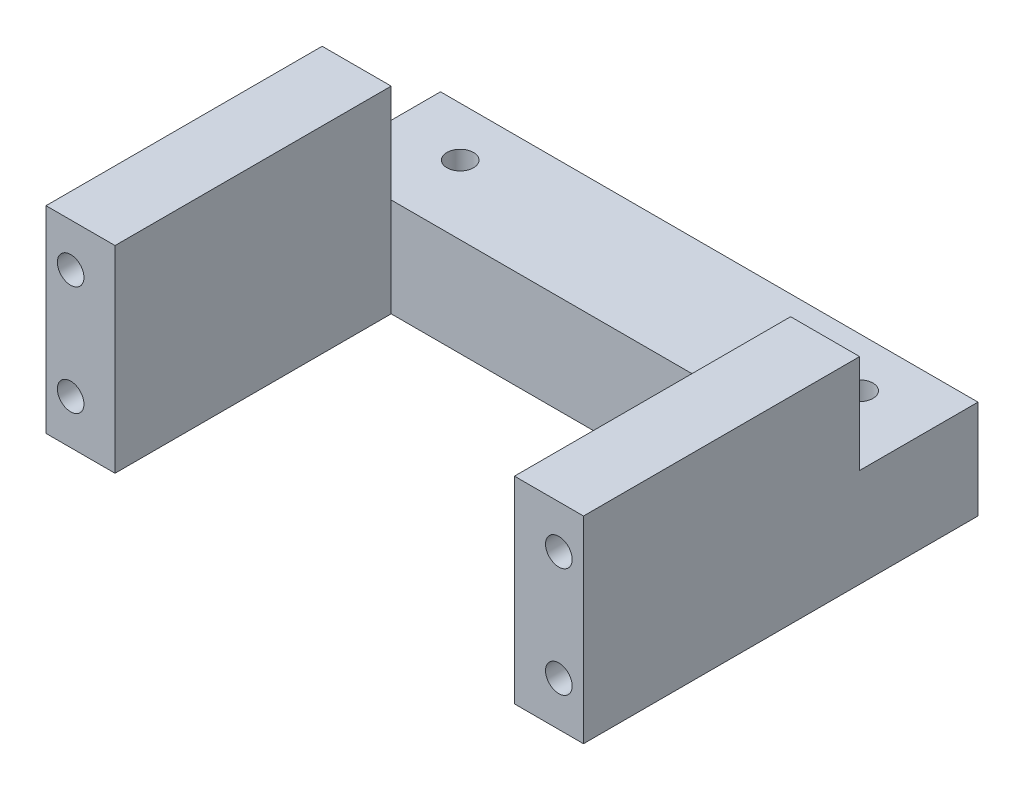
ISO-10303-21;
HEADER;
FILE_DESCRIPTION(('STEP AP214'),'2;1');
FILE_NAME('part.step','',(''),(''),'','','');
FILE_SCHEMA(('AUTOMOTIVE_DESIGN { 1 0 10303 214 1 1 1 1 }'));
ENDSEC;
DATA;
#1=APPLICATION_CONTEXT('core data for automotive mechanical design processes');
#2=APPLICATION_PROTOCOL_DEFINITION('international standard','automotive_design',2000,#1);
#3=PRODUCT_CONTEXT('',#1,'mechanical');
#4=PRODUCT('Part','Part','',(#3));
#5=PRODUCT_RELATED_PRODUCT_CATEGORY('part','',(#4));
#6=PRODUCT_DEFINITION_FORMATION('','',#4);
#7=PRODUCT_DEFINITION_CONTEXT('part definition',#1,'design');
#8=PRODUCT_DEFINITION('design','',#6,#7);
#9=PRODUCT_DEFINITION_SHAPE('','',#8);
#10=(LENGTH_UNIT() NAMED_UNIT(*) SI_UNIT(.MILLI.,.METRE.));
#11=(NAMED_UNIT(*) PLANE_ANGLE_UNIT() SI_UNIT($,.RADIAN.));
#12=(NAMED_UNIT(*) SI_UNIT($,.STERADIAN.) SOLID_ANGLE_UNIT());
#13=UNCERTAINTY_MEASURE_WITH_UNIT(LENGTH_MEASURE(1.E-05),#10,'distance_accuracy_value','');
#14=(GEOMETRIC_REPRESENTATION_CONTEXT(3) GLOBAL_UNCERTAINTY_ASSIGNED_CONTEXT((#13)) GLOBAL_UNIT_ASSIGNED_CONTEXT((#10,
#11,#12)) REPRESENTATION_CONTEXT('',''));
#15=CARTESIAN_POINT('',(0.,0.,0.));
#16=DIRECTION('',(0.,0.,1.));
#17=DIRECTION('',(1.,0.,0.));
#18=AXIS2_PLACEMENT_3D('',#15,#16,#17);
#19=CARTESIAN_POINT('',(0.,10.,0.));
#20=DIRECTION('',(0.,-1.,0.));
#21=DIRECTION('',(0.,0.,-1.));
#22=AXIS2_PLACEMENT_3D('',#19,#20,#21);
#23=PLANE('',#22);
#24=CARTESIAN_POINT('',(-20.25,10.,-15.));
#25=DIRECTION('',(0.,1.,0.));
#26=DIRECTION('',(0.,0.,1.));
#27=AXIS2_PLACEMENT_3D('',#24,#25,#26);
#28=CIRCLE('',#27,1.35);
#29=CARTESIAN_POINT('',(-20.25,10.,-13.65));
#30=VERTEX_POINT('',#29);
#31=EDGE_CURVE('E216',#30,#30,#28,.T.);
#32=ORIENTED_EDGE('',*,*,#31,.F.);
#33=EDGE_LOOP('',(#32));
#34=FACE_BOUND('',#33,.T.);
#35=CARTESIAN_POINT('',(20.25,10.,-15.));
#36=DIRECTION('',(0.,1.,0.));
#37=DIRECTION('',(0.,0.,-1.));
#38=AXIS2_PLACEMENT_3D('',#35,#36,#37);
#39=CIRCLE('',#38,1.35);
#40=CARTESIAN_POINT('',(20.25,10.,-16.35));
#41=VERTEX_POINT('',#40);
#42=EDGE_CURVE('E208',#41,#41,#39,.T.);
#43=ORIENTED_EDGE('',*,*,#42,.F.);
#44=EDGE_LOOP('',(#43));
#45=FACE_BOUND('',#44,.T.);
#46=DIRECTION('',(-1.,0.,0.));
#47=VECTOR('',#46,1.);
#48=CARTESIAN_POINT('',(0.,10.,-8.));
#49=LINE('',#48,#47);
#50=CARTESIAN_POINT('',(-20.25,10.,-8.));
#51=VERTEX_POINT('',#50);
#52=CARTESIAN_POINT('',(-27.25,10.,-8.));
#53=VERTEX_POINT('',#52);
#54=EDGE_CURVE('E203',#51,#53,#49,.T.);
#55=ORIENTED_EDGE('',*,*,#54,.F.);
#56=DIRECTION('',(1.,0.,0.));
#57=VECTOR('',#56,1.);
#58=CARTESIAN_POINT('',(-20.25,10.,-8.));
#59=LINE('',#58,#57);
#60=CARTESIAN_POINT('',(20.25,10.,-8.));
#61=VERTEX_POINT('',#60);
#62=EDGE_CURVE('E66',#51,#61,#59,.T.);
#63=ORIENTED_EDGE('',*,*,#62,.T.);
#64=DIRECTION('',(-1.,0.,0.));
#65=VECTOR('',#64,1.);
#66=CARTESIAN_POINT('',(0.,10.,-8.));
#67=LINE('',#66,#65);
#68=CARTESIAN_POINT('',(27.25,10.,-8.));
#69=VERTEX_POINT('',#68);
#70=EDGE_CURVE('E60',#69,#61,#67,.T.);
#71=ORIENTED_EDGE('',*,*,#70,.F.);
#72=DIRECTION('',(0.,0.,-1.));
#73=VECTOR('',#72,1.);
#74=CARTESIAN_POINT('',(27.25,10.,20.));
#75=LINE('',#74,#73);
#76=CARTESIAN_POINT('',(27.25,10.,-20.));
#77=VERTEX_POINT('',#76);
#78=EDGE_CURVE('E104',#69,#77,#75,.T.);
#79=ORIENTED_EDGE('',*,*,#78,.T.);
#80=DIRECTION('',(-1.,0.,0.));
#81=VECTOR('',#80,1.);
#82=CARTESIAN_POINT('',(-27.25,10.,-20.));
#83=LINE('',#82,#81);
#84=CARTESIAN_POINT('',(-27.25,10.,-20.));
#85=VERTEX_POINT('',#84);
#86=EDGE_CURVE('E226',#77,#85,#83,.T.);
#87=ORIENTED_EDGE('',*,*,#86,.T.);
#88=DIRECTION('',(0.,0.,1.));
#89=VECTOR('',#88,1.);
#90=CARTESIAN_POINT('',(-27.25,10.,20.));
#91=LINE('',#90,#89);
#92=EDGE_CURVE('E229',#85,#53,#91,.T.);
#93=ORIENTED_EDGE('',*,*,#92,.T.);
#94=EDGE_LOOP('',(#55,#63,#71,#79,#87,#93));
#95=FACE_BOUND('',#94,.T.);
#96=ADVANCED_FACE('F44',(#34,#45,#95),#23,.F.);
#97=CARTESIAN_POINT('',(0.,0.,0.));
#98=DIRECTION('',(0.,-1.,0.));
#99=DIRECTION('',(0.,0.,-1.));
#100=AXIS2_PLACEMENT_3D('',#97,#98,#99);
#101=PLANE('',#100);
#102=DIRECTION('',(0.,0.,1.));
#103=VECTOR('',#102,1.);
#104=CARTESIAN_POINT('',(20.25,0.,-8.));
#105=LINE('',#104,#103);
#106=CARTESIAN_POINT('',(20.25,0.,-8.));
#107=VERTEX_POINT('',#106);
#108=CARTESIAN_POINT('',(20.25,0.,20.));
#109=VERTEX_POINT('',#108);
#110=EDGE_CURVE('E251',#107,#109,#105,.T.);
#111=ORIENTED_EDGE('',*,*,#110,.F.);
#112=DIRECTION('',(1.,0.,0.));
#113=VECTOR('',#112,1.);
#114=CARTESIAN_POINT('',(-20.25,0.,-8.));
#115=LINE('',#114,#113);
#116=CARTESIAN_POINT('',(-20.25,0.,-8.));
#117=VERTEX_POINT('',#116);
#118=EDGE_CURVE('E248',#117,#107,#115,.T.);
#119=ORIENTED_EDGE('',*,*,#118,.F.);
#120=DIRECTION('',(0.,0.,-1.));
#121=VECTOR('',#120,1.);
#122=CARTESIAN_POINT('',(-20.25,0.,20.));
#123=LINE('',#122,#121);
#124=CARTESIAN_POINT('',(-20.25,0.,20.));
#125=VERTEX_POINT('',#124);
#126=EDGE_CURVE('E245',#125,#117,#123,.T.);
#127=ORIENTED_EDGE('',*,*,#126,.F.);
#128=DIRECTION('',(1.,0.,0.));
#129=VECTOR('',#128,1.);
#130=CARTESIAN_POINT('',(-27.25,0.,20.));
#131=LINE('',#130,#129);
#132=CARTESIAN_POINT('',(-27.25,0.,20.));
#133=VERTEX_POINT('',#132);
#134=EDGE_CURVE('E242',#133,#125,#131,.T.);
#135=ORIENTED_EDGE('',*,*,#134,.F.);
#136=DIRECTION('',(0.,0.,1.));
#137=VECTOR('',#136,1.);
#138=CARTESIAN_POINT('',(-27.25,0.,20.));
#139=LINE('',#138,#137);
#140=CARTESIAN_POINT('',(-27.25,0.,-20.));
#141=VERTEX_POINT('',#140);
#142=EDGE_CURVE('E142',#141,#133,#139,.T.);
#143=ORIENTED_EDGE('',*,*,#142,.F.);
#144=DIRECTION('',(-1.,0.,0.));
#145=VECTOR('',#144,1.);
#146=CARTESIAN_POINT('',(-27.25,0.,-20.));
#147=LINE('',#146,#145);
#148=CARTESIAN_POINT('',(27.25,0.,-20.));
#149=VERTEX_POINT('',#148);
#150=EDGE_CURVE('E237',#149,#141,#147,.T.);
#151=ORIENTED_EDGE('',*,*,#150,.F.);
#152=DIRECTION('',(0.,0.,-1.));
#153=VECTOR('',#152,1.);
#154=CARTESIAN_POINT('',(27.25,0.,20.));
#155=LINE('',#154,#153);
#156=CARTESIAN_POINT('',(27.25,0.,20.));
#157=VERTEX_POINT('',#156);
#158=EDGE_CURVE('E220',#157,#149,#155,.T.);
#159=ORIENTED_EDGE('',*,*,#158,.F.);
#160=DIRECTION('',(1.,0.,0.));
#161=VECTOR('',#160,1.);
#162=CARTESIAN_POINT('',(20.25,0.,20.));
#163=LINE('',#162,#161);
#164=EDGE_CURVE('E100',#109,#157,#163,.T.);
#165=ORIENTED_EDGE('',*,*,#164,.F.);
#166=EDGE_LOOP('',(#111,#119,#127,#135,#143,#151,#159,#165));
#167=FACE_BOUND('',#166,.T.);
#168=CARTESIAN_POINT('',(-20.25,0.,-15.));
#169=DIRECTION('',(0.,1.,0.));
#170=DIRECTION('',(0.,0.,1.));
#171=AXIS2_PLACEMENT_3D('',#168,#169,#170);
#172=CIRCLE('',#171,1.35);
#173=CARTESIAN_POINT('',(-20.25,0.,-13.65));
#174=VERTEX_POINT('',#173);
#175=EDGE_CURVE('E212',#174,#174,#172,.T.);
#176=ORIENTED_EDGE('',*,*,#175,.T.);
#177=EDGE_LOOP('',(#176));
#178=FACE_BOUND('',#177,.T.);
#179=CARTESIAN_POINT('',(20.25,0.,-15.));
#180=DIRECTION('',(0.,1.,0.));
#181=DIRECTION('',(0.,0.,-1.));
#182=AXIS2_PLACEMENT_3D('',#179,#180,#181);
#183=CIRCLE('',#182,1.35);
#184=CARTESIAN_POINT('',(20.25,0.,-16.35));
#185=VERTEX_POINT('',#184);
#186=EDGE_CURVE('E207',#185,#185,#183,.T.);
#187=ORIENTED_EDGE('',*,*,#186,.T.);
#188=EDGE_LOOP('',(#187));
#189=FACE_BOUND('',#188,.T.);
#190=ADVANCED_FACE('F277',(#167,#178,#189),#101,.T.);
#191=CARTESIAN_POINT('',(27.25,10.,20.));
#192=DIRECTION('',(-1.,0.,0.));
#193=DIRECTION('',(0.,0.,1.));
#194=AXIS2_PLACEMENT_3D('',#191,#192,#193);
#195=PLANE('',#194);
#196=ORIENTED_EDGE('',*,*,#158,.T.);
#197=DIRECTION('',(0.,-1.,0.));
#198=VECTOR('',#197,1.);
#199=CARTESIAN_POINT('',(27.25,10.,-20.));
#200=LINE('',#199,#198);
#201=EDGE_CURVE('E11',#77,#149,#200,.T.);
#202=ORIENTED_EDGE('',*,*,#201,.F.);
#203=ORIENTED_EDGE('',*,*,#78,.F.);
#204=DIRECTION('',(0.,-1.,0.));
#205=VECTOR('',#204,1.);
#206=CARTESIAN_POINT('',(27.25,20.,-8.));
#207=LINE('',#206,#205);
#208=CARTESIAN_POINT('',(27.25,20.,-8.));
#209=VERTEX_POINT('',#208);
#210=EDGE_CURVE('E183',#209,#69,#207,.T.);
#211=ORIENTED_EDGE('',*,*,#210,.F.);
#212=DIRECTION('',(0.,0.,-1.));
#213=VECTOR('',#212,1.);
#214=CARTESIAN_POINT('',(27.25,20.,20.));
#215=LINE('',#214,#213);
#216=CARTESIAN_POINT('',(27.25,20.,20.));
#217=VERTEX_POINT('',#216);
#218=EDGE_CURVE('E166',#217,#209,#215,.T.);
#219=ORIENTED_EDGE('',*,*,#218,.F.);
#220=DIRECTION('',(0.,-1.,0.));
#221=VECTOR('',#220,1.);
#222=CARTESIAN_POINT('',(27.25,10.,20.));
#223=LINE('',#222,#221);
#224=EDGE_CURVE('E234',#217,#157,#223,.T.);
#225=ORIENTED_EDGE('',*,*,#224,.T.);
#226=EDGE_LOOP('',(#196,#202,#203,#211,#219,#225));
#227=FACE_BOUND('',#226,.T.);
#228=ADVANCED_FACE('F46',(#227),#195,.F.);
#229=CARTESIAN_POINT('',(-27.25,10.,-20.));
#230=DIRECTION('',(0.,0.,1.));
#231=DIRECTION('',(1.,0.,0.));
#232=AXIS2_PLACEMENT_3D('',#229,#230,#231);
#233=PLANE('',#232);
#234=ORIENTED_EDGE('',*,*,#150,.T.);
#235=DIRECTION('',(0.,-1.,0.));
#236=VECTOR('',#235,1.);
#237=CARTESIAN_POINT('',(-27.25,10.,-20.));
#238=LINE('',#237,#236);
#239=EDGE_CURVE('E53',#85,#141,#238,.T.);
#240=ORIENTED_EDGE('',*,*,#239,.F.);
#241=ORIENTED_EDGE('',*,*,#86,.F.);
#242=ORIENTED_EDGE('',*,*,#201,.T.);
#243=EDGE_LOOP('',(#234,#240,#241,#242));
#244=FACE_BOUND('',#243,.T.);
#245=ADVANCED_FACE('F289',(#244),#233,.F.);
#246=CARTESIAN_POINT('',(-27.25,10.,20.));
#247=DIRECTION('',(1.,0.,0.));
#248=DIRECTION('',(0.,0.,-1.));
#249=AXIS2_PLACEMENT_3D('',#246,#247,#248);
#250=PLANE('',#249);
#251=DIRECTION('',(0.,-1.,0.));
#252=VECTOR('',#251,1.);
#253=CARTESIAN_POINT('',(-27.25,10.,20.));
#254=LINE('',#253,#252);
#255=CARTESIAN_POINT('',(-27.25,20.,20.));
#256=VERTEX_POINT('',#255);
#257=EDGE_CURVE('E134',#256,#133,#254,.T.);
#258=ORIENTED_EDGE('',*,*,#257,.F.);
#259=DIRECTION('',(0.,0.,1.));
#260=VECTOR('',#259,1.);
#261=CARTESIAN_POINT('',(-27.25,20.,20.));
#262=LINE('',#261,#260);
#263=CARTESIAN_POINT('',(-27.25,20.,-8.));
#264=VERTEX_POINT('',#263);
#265=EDGE_CURVE('E139',#264,#256,#262,.T.);
#266=ORIENTED_EDGE('',*,*,#265,.F.);
#267=DIRECTION('',(0.,-1.,0.));
#268=VECTOR('',#267,1.);
#269=CARTESIAN_POINT('',(-27.25,20.,-8.));
#270=LINE('',#269,#268);
#271=EDGE_CURVE('E176',#264,#53,#270,.T.);
#272=ORIENTED_EDGE('',*,*,#271,.T.);
#273=ORIENTED_EDGE('',*,*,#92,.F.);
#274=ORIENTED_EDGE('',*,*,#239,.T.);
#275=ORIENTED_EDGE('',*,*,#142,.T.);
#276=EDGE_LOOP('',(#258,#266,#272,#273,#274,#275));
#277=FACE_BOUND('',#276,.T.);
#278=ADVANCED_FACE('F136',(#277),#250,.F.);
#279=CARTESIAN_POINT('',(-27.25,10.,20.));
#280=DIRECTION('',(0.,0.,-1.));
#281=DIRECTION('',(-1.,0.,0.));
#282=AXIS2_PLACEMENT_3D('',#279,#280,#281);
#283=PLANE('',#282);
#284=CARTESIAN_POINT('',(-24.75,4.5,20.));
#285=DIRECTION('',(0.,0.,1.));
#286=DIRECTION('',(1.,0.,0.));
#287=AXIS2_PLACEMENT_3D('',#284,#285,#286);
#288=CIRCLE('',#287,1.35);
#289=CARTESIAN_POINT('',(-23.4,4.5,20.));
#290=VERTEX_POINT('',#289);
#291=EDGE_CURVE('E497',#290,#290,#288,.T.);
#292=ORIENTED_EDGE('',*,*,#291,.F.);
#293=EDGE_LOOP('',(#292));
#294=FACE_BOUND('',#293,.T.);
#295=CARTESIAN_POINT('',(-24.75,15.6125178063039,20.));
#296=DIRECTION('',(0.,0.,1.));
#297=DIRECTION('',(1.,0.,0.));
#298=AXIS2_PLACEMENT_3D('',#295,#296,#297);
#299=CIRCLE('',#298,1.35);
#300=CARTESIAN_POINT('',(-23.4,15.6125178063039,20.));
#301=VERTEX_POINT('',#300);
#302=EDGE_CURVE('E169',#301,#301,#299,.T.);
#303=ORIENTED_EDGE('',*,*,#302,.F.);
#304=EDGE_LOOP('',(#303));
#305=FACE_BOUND('',#304,.T.);
#306=ORIENTED_EDGE('',*,*,#134,.T.);
#307=DIRECTION('',(0.,-1.,0.));
#308=VECTOR('',#307,1.);
#309=CARTESIAN_POINT('',(-20.25,10.,20.));
#310=LINE('',#309,#308);
#311=CARTESIAN_POINT('',(-20.25,20.,20.));
#312=VERTEX_POINT('',#311);
#313=EDGE_CURVE('E146',#312,#125,#310,.T.);
#314=ORIENTED_EDGE('',*,*,#313,.F.);
#315=DIRECTION('',(1.,0.,0.));
#316=VECTOR('',#315,1.);
#317=CARTESIAN_POINT('',(-27.25,20.,20.));
#318=LINE('',#317,#316);
#319=EDGE_CURVE('E149',#256,#312,#318,.T.);
#320=ORIENTED_EDGE('',*,*,#319,.F.);
#321=ORIENTED_EDGE('',*,*,#257,.T.);
#322=EDGE_LOOP('',(#306,#314,#320,#321));
#323=FACE_BOUND('',#322,.T.);
#324=ADVANCED_FACE('F150',(#294,#305,#323),#283,.F.);
#325=CARTESIAN_POINT('',(-20.25,10.,20.));
#326=DIRECTION('',(-1.,0.,0.));
#327=DIRECTION('',(0.,0.,1.));
#328=AXIS2_PLACEMENT_3D('',#325,#326,#327);
#329=PLANE('',#328);
#330=ORIENTED_EDGE('',*,*,#126,.T.);
#331=DIRECTION('',(0.,-1.,0.));
#332=VECTOR('',#331,1.);
#333=CARTESIAN_POINT('',(-20.25,10.,-8.));
#334=LINE('',#333,#332);
#335=EDGE_CURVE('E265',#51,#117,#334,.T.);
#336=ORIENTED_EDGE('',*,*,#335,.F.);
#337=DIRECTION('',(0.,-1.,0.));
#338=VECTOR('',#337,1.);
#339=CARTESIAN_POINT('',(-20.25,20.,-8.));
#340=LINE('',#339,#338);
#341=CARTESIAN_POINT('',(-20.25,20.,-8.));
#342=VERTEX_POINT('',#341);
#343=EDGE_CURVE('E179',#342,#51,#340,.T.);
#344=ORIENTED_EDGE('',*,*,#343,.F.);
#345=DIRECTION('',(0.,0.,-1.));
#346=VECTOR('',#345,1.);
#347=CARTESIAN_POINT('',(-20.25,20.,20.));
#348=LINE('',#347,#346);
#349=EDGE_CURVE('E155',#312,#342,#348,.T.);
#350=ORIENTED_EDGE('',*,*,#349,.F.);
#351=ORIENTED_EDGE('',*,*,#313,.T.);
#352=EDGE_LOOP('',(#330,#336,#344,#350,#351));
#353=FACE_BOUND('',#352,.T.);
#354=ADVANCED_FACE('F283',(#353),#329,.F.);
#355=CARTESIAN_POINT('',(-20.25,10.,-8.));
#356=DIRECTION('',(0.,0.,-1.));
#357=DIRECTION('',(-1.,0.,0.));
#358=AXIS2_PLACEMENT_3D('',#355,#356,#357);
#359=PLANE('',#358);
#360=ORIENTED_EDGE('',*,*,#118,.T.);
#361=DIRECTION('',(0.,-1.,0.));
#362=VECTOR('',#361,1.);
#363=CARTESIAN_POINT('',(20.25,10.,-8.));
#364=LINE('',#363,#362);
#365=EDGE_CURVE('E261',#61,#107,#364,.T.);
#366=ORIENTED_EDGE('',*,*,#365,.F.);
#367=ORIENTED_EDGE('',*,*,#62,.F.);
#368=ORIENTED_EDGE('',*,*,#335,.T.);
#369=EDGE_LOOP('',(#360,#366,#367,#368));
#370=FACE_BOUND('',#369,.T.);
#371=ADVANCED_FACE('F332',(#370),#359,.F.);
#372=CARTESIAN_POINT('',(20.25,10.,-8.));
#373=DIRECTION('',(1.,0.,0.));
#374=DIRECTION('',(0.,0.,-1.));
#375=AXIS2_PLACEMENT_3D('',#372,#373,#374);
#376=PLANE('',#375);
#377=ORIENTED_EDGE('',*,*,#110,.T.);
#378=DIRECTION('',(0.,-1.,0.));
#379=VECTOR('',#378,1.);
#380=CARTESIAN_POINT('',(20.25,10.,20.));
#381=LINE('',#380,#379);
#382=CARTESIAN_POINT('',(20.25,20.,20.));
#383=VERTEX_POINT('',#382);
#384=EDGE_CURVE('E258',#383,#109,#381,.T.);
#385=ORIENTED_EDGE('',*,*,#384,.F.);
#386=DIRECTION('',(0.,0.,1.));
#387=VECTOR('',#386,1.);
#388=CARTESIAN_POINT('',(20.25,20.,-8.));
#389=LINE('',#388,#387);
#390=CARTESIAN_POINT('',(20.25,20.,-8.));
#391=VERTEX_POINT('',#390);
#392=EDGE_CURVE('E192',#391,#383,#389,.T.);
#393=ORIENTED_EDGE('',*,*,#392,.F.);
#394=DIRECTION('',(0.,-1.,0.));
#395=VECTOR('',#394,1.);
#396=CARTESIAN_POINT('',(20.25,20.,-8.));
#397=LINE('',#396,#395);
#398=EDGE_CURVE('E187',#391,#61,#397,.T.);
#399=ORIENTED_EDGE('',*,*,#398,.T.);
#400=ORIENTED_EDGE('',*,*,#365,.T.);
#401=EDGE_LOOP('',(#377,#385,#393,#399,#400));
#402=FACE_BOUND('',#401,.T.);
#403=ADVANCED_FACE('F294',(#402),#376,.F.);
#404=CARTESIAN_POINT('',(20.25,10.,20.));
#405=DIRECTION('',(0.,0.,-1.));
#406=DIRECTION('',(-1.,0.,0.));
#407=AXIS2_PLACEMENT_3D('',#404,#405,#406);
#408=PLANE('',#407);
#409=CARTESIAN_POINT('',(24.75,15.6125178063039,20.));
#410=DIRECTION('',(0.,0.,1.));
#411=DIRECTION('',(-1.,0.,0.));
#412=AXIS2_PLACEMENT_3D('',#409,#410,#411);
#413=CIRCLE('',#412,1.35);
#414=CARTESIAN_POINT('',(23.4,15.6125178063039,20.));
#415=VERTEX_POINT('',#414);
#416=EDGE_CURVE('E511',#415,#415,#413,.T.);
#417=ORIENTED_EDGE('',*,*,#416,.F.);
#418=EDGE_LOOP('',(#417));
#419=FACE_BOUND('',#418,.T.);
#420=CARTESIAN_POINT('',(24.75,4.5,20.));
#421=DIRECTION('',(0.,0.,1.));
#422=DIRECTION('',(-1.,0.,0.));
#423=AXIS2_PLACEMENT_3D('',#420,#421,#422);
#424=CIRCLE('',#423,1.35);
#425=CARTESIAN_POINT('',(23.4,4.5,20.));
#426=VERTEX_POINT('',#425);
#427=EDGE_CURVE('E498',#426,#426,#424,.T.);
#428=ORIENTED_EDGE('',*,*,#427,.F.);
#429=EDGE_LOOP('',(#428));
#430=FACE_BOUND('',#429,.T.);
#431=ORIENTED_EDGE('',*,*,#164,.T.);
#432=ORIENTED_EDGE('',*,*,#224,.F.);
#433=DIRECTION('',(1.,0.,0.));
#434=VECTOR('',#433,1.);
#435=CARTESIAN_POINT('',(20.25,20.,20.));
#436=LINE('',#435,#434);
#437=EDGE_CURVE('E162',#383,#217,#436,.T.);
#438=ORIENTED_EDGE('',*,*,#437,.F.);
#439=ORIENTED_EDGE('',*,*,#384,.T.);
#440=EDGE_LOOP('',(#431,#432,#438,#439));
#441=FACE_BOUND('',#440,.T.);
#442=ADVANCED_FACE('F297',(#419,#430,#441),#408,.F.);
#443=CARTESIAN_POINT('',(-20.25,10.,-15.));
#444=DIRECTION('',(0.,-1.,0.));
#445=DIRECTION('',(0.,0.,-1.));
#446=AXIS2_PLACEMENT_3D('',#443,#444,#445);
#447=CYLINDRICAL_SURFACE('',#446,1.35);
#448=ORIENTED_EDGE('',*,*,#31,.T.);
#449=EDGE_LOOP('',(#448));
#450=FACE_BOUND('',#449,.T.);
#451=ORIENTED_EDGE('',*,*,#175,.F.);
#452=EDGE_LOOP('',(#451));
#453=FACE_BOUND('',#452,.T.);
#454=ADVANCED_FACE('F313',(#450,#453),#447,.F.);
#455=CARTESIAN_POINT('',(20.25,10.,-15.));
#456=DIRECTION('',(0.,-1.,0.));
#457=DIRECTION('',(0.,0.,-1.));
#458=AXIS2_PLACEMENT_3D('',#455,#456,#457);
#459=CYLINDRICAL_SURFACE('',#458,1.35);
#460=ORIENTED_EDGE('',*,*,#42,.T.);
#461=EDGE_LOOP('',(#460));
#462=FACE_BOUND('',#461,.T.);
#463=ORIENTED_EDGE('',*,*,#186,.F.);
#464=EDGE_LOOP('',(#463));
#465=FACE_BOUND('',#464,.T.);
#466=ADVANCED_FACE('F305',(#462,#465),#459,.F.);
#467=CARTESIAN_POINT('',(20.25,20.,-8.));
#468=DIRECTION('',(0.,0.,1.));
#469=DIRECTION('',(1.,0.,0.));
#470=AXIS2_PLACEMENT_3D('',#467,#468,#469);
#471=PLANE('',#470);
#472=ORIENTED_EDGE('',*,*,#210,.T.);
#473=ORIENTED_EDGE('',*,*,#70,.T.);
#474=ORIENTED_EDGE('',*,*,#398,.F.);
#475=DIRECTION('',(-1.,0.,0.));
#476=VECTOR('',#475,1.);
#477=CARTESIAN_POINT('',(20.25,20.,-8.));
#478=LINE('',#477,#476);
#479=EDGE_CURVE('E196',#209,#391,#478,.T.);
#480=ORIENTED_EDGE('',*,*,#479,.F.);
#481=EDGE_LOOP('',(#472,#473,#474,#480));
#482=FACE_BOUND('',#481,.T.);
#483=ADVANCED_FACE('F303',(#482),#471,.F.);
#484=CARTESIAN_POINT('',(0.,20.,0.));
#485=DIRECTION('',(0.,1.,0.));
#486=DIRECTION('',(0.,0.,1.));
#487=AXIS2_PLACEMENT_3D('',#484,#485,#486);
#488=PLANE('',#487);
#489=ORIENTED_EDGE('',*,*,#437,.T.);
#490=ORIENTED_EDGE('',*,*,#218,.T.);
#491=ORIENTED_EDGE('',*,*,#479,.T.);
#492=ORIENTED_EDGE('',*,*,#392,.T.);
#493=EDGE_LOOP('',(#489,#490,#491,#492));
#494=FACE_BOUND('',#493,.T.);
#495=ADVANCED_FACE('F299',(#494),#488,.T.);
#496=CARTESIAN_POINT('',(-27.25,20.,-8.));
#497=DIRECTION('',(0.,0.,1.));
#498=DIRECTION('',(1.,0.,0.));
#499=AXIS2_PLACEMENT_3D('',#496,#497,#498);
#500=PLANE('',#499);
#501=ORIENTED_EDGE('',*,*,#343,.T.);
#502=ORIENTED_EDGE('',*,*,#54,.T.);
#503=ORIENTED_EDGE('',*,*,#271,.F.);
#504=DIRECTION('',(-1.,0.,0.));
#505=VECTOR('',#504,1.);
#506=CARTESIAN_POINT('',(-27.25,20.,-8.));
#507=LINE('',#506,#505);
#508=EDGE_CURVE('E159',#342,#264,#507,.T.);
#509=ORIENTED_EDGE('',*,*,#508,.F.);
#510=EDGE_LOOP('',(#501,#502,#503,#509));
#511=FACE_BOUND('',#510,.T.);
#512=ADVANCED_FACE('F287',(#511),#500,.F.);
#513=CARTESIAN_POINT('',(0.,20.,0.));
#514=DIRECTION('',(0.,-1.,0.));
#515=DIRECTION('',(0.,0.,-1.));
#516=AXIS2_PLACEMENT_3D('',#513,#514,#515);
#517=PLANE('',#516);
#518=ORIENTED_EDGE('',*,*,#265,.T.);
#519=ORIENTED_EDGE('',*,*,#319,.T.);
#520=ORIENTED_EDGE('',*,*,#349,.T.);
#521=ORIENTED_EDGE('',*,*,#508,.T.);
#522=EDGE_LOOP('',(#518,#519,#520,#521));
#523=FACE_BOUND('',#522,.T.);
#524=ADVANCED_FACE('F157',(#523),#517,.F.);
#525=CARTESIAN_POINT('',(24.75,4.5,4.99999999999999));
#526=DIRECTION('',(0.,0.,1.));
#527=DIRECTION('',(1.,0.,0.));
#528=AXIS2_PLACEMENT_3D('',#525,#526,#527);
#529=CYLINDRICAL_SURFACE('',#528,1.35);
#530=CARTESIAN_POINT('',(24.75,4.5,4.99999999999999));
#531=DIRECTION('',(0.,0.,1.));
#532=DIRECTION('',(-1.,0.,0.));
#533=AXIS2_PLACEMENT_3D('',#530,#531,#532);
#534=CIRCLE('',#533,1.35);
#535=CARTESIAN_POINT('',(23.4,4.5,4.99999999999999));
#536=VERTEX_POINT('',#535);
#537=EDGE_CURVE('E505',#536,#536,#534,.T.);
#538=ORIENTED_EDGE('',*,*,#537,.F.);
#539=EDGE_LOOP('',(#538));
#540=FACE_BOUND('',#539,.T.);
#541=ORIENTED_EDGE('',*,*,#427,.T.);
#542=EDGE_LOOP('',(#541));
#543=FACE_BOUND('',#542,.T.);
#544=ADVANCED_FACE('F412',(#540,#543),#529,.F.);
#545=CARTESIAN_POINT('',(24.75,4.5,4.99999999999999));
#546=DIRECTION('',(0.,0.,-1.));
#547=DIRECTION('',(-1.,0.,0.));
#548=AXIS2_PLACEMENT_3D('',#545,#546,#547);
#549=PLANE('',#548);
#550=ORIENTED_EDGE('',*,*,#537,.T.);
#551=EDGE_LOOP('',(#550));
#552=FACE_BOUND('',#551,.T.);
#553=ADVANCED_FACE('F420',(#552),#549,.F.);
#554=CARTESIAN_POINT('',(24.75,15.6125178063039,4.99999999999999));
#555=DIRECTION('',(0.,0.,1.));
#556=DIRECTION('',(1.,0.,0.));
#557=AXIS2_PLACEMENT_3D('',#554,#555,#556);
#558=CYLINDRICAL_SURFACE('',#557,1.35);
#559=CARTESIAN_POINT('',(24.75,15.6125178063039,4.99999999999999));
#560=DIRECTION('',(0.,0.,1.));
#561=DIRECTION('',(-1.,0.,0.));
#562=AXIS2_PLACEMENT_3D('',#559,#560,#561);
#563=CIRCLE('',#562,1.35);
#564=CARTESIAN_POINT('',(23.4,15.6125178063039,4.99999999999999));
#565=VERTEX_POINT('',#564);
#566=EDGE_CURVE('E515',#565,#565,#563,.T.);
#567=ORIENTED_EDGE('',*,*,#566,.F.);
#568=EDGE_LOOP('',(#567));
#569=FACE_BOUND('',#568,.T.);
#570=ORIENTED_EDGE('',*,*,#416,.T.);
#571=EDGE_LOOP('',(#570));
#572=FACE_BOUND('',#571,.T.);
#573=ADVANCED_FACE('F430',(#569,#572),#558,.F.);
#574=CARTESIAN_POINT('',(24.75,15.6125178063039,4.99999999999999));
#575=DIRECTION('',(0.,0.,-1.));
#576=DIRECTION('',(-1.,0.,0.));
#577=AXIS2_PLACEMENT_3D('',#574,#575,#576);
#578=PLANE('',#577);
#579=ORIENTED_EDGE('',*,*,#566,.T.);
#580=EDGE_LOOP('',(#579));
#581=FACE_BOUND('',#580,.T.);
#582=ADVANCED_FACE('F440',(#581),#578,.F.);
#583=CARTESIAN_POINT('',(-24.75,15.6125178063039,4.99999999999999));
#584=DIRECTION('',(0.,0.,1.));
#585=DIRECTION('',(1.,0.,0.));
#586=AXIS2_PLACEMENT_3D('',#583,#584,#585);
#587=CYLINDRICAL_SURFACE('',#586,1.35);
#588=CARTESIAN_POINT('',(-24.75,15.6125178063039,4.99999999999999));
#589=DIRECTION('',(0.,0.,1.));
#590=DIRECTION('',(1.,0.,0.));
#591=AXIS2_PLACEMENT_3D('',#588,#589,#590);
#592=CIRCLE('',#591,1.35);
#593=CARTESIAN_POINT('',(-23.4,15.6125178063039,4.99999999999999));
#594=VERTEX_POINT('',#593);
#595=EDGE_CURVE('E188',#594,#594,#592,.T.);
#596=ORIENTED_EDGE('',*,*,#595,.F.);
#597=EDGE_LOOP('',(#596));
#598=FACE_BOUND('',#597,.T.);
#599=ORIENTED_EDGE('',*,*,#302,.T.);
#600=EDGE_LOOP('',(#599));
#601=FACE_BOUND('',#600,.T.);
#602=ADVANCED_FACE('F450',(#598,#601),#587,.F.);
#603=CARTESIAN_POINT('',(-24.75,15.6125178063039,4.99999999999999));
#604=DIRECTION('',(0.,0.,1.));
#605=DIRECTION('',(1.,0.,0.));
#606=AXIS2_PLACEMENT_3D('',#603,#604,#605);
#607=PLANE('',#606);
#608=ORIENTED_EDGE('',*,*,#595,.T.);
#609=EDGE_LOOP('',(#608));
#610=FACE_BOUND('',#609,.T.);
#611=ADVANCED_FACE('F460',(#610),#607,.T.);
#612=CARTESIAN_POINT('',(-24.75,4.5,4.99999999999999));
#613=DIRECTION('',(0.,0.,1.));
#614=DIRECTION('',(1.,0.,0.));
#615=AXIS2_PLACEMENT_3D('',#612,#613,#614);
#616=CYLINDRICAL_SURFACE('',#615,1.35);
#617=CARTESIAN_POINT('',(-24.75,4.5,4.99999999999999));
#618=DIRECTION('',(0.,0.,1.));
#619=DIRECTION('',(1.,0.,0.));
#620=AXIS2_PLACEMENT_3D('',#617,#618,#619);
#621=CIRCLE('',#620,1.35);
#622=CARTESIAN_POINT('',(-23.4,4.5,4.99999999999999));
#623=VERTEX_POINT('',#622);
#624=EDGE_CURVE('E495',#623,#623,#621,.T.);
#625=ORIENTED_EDGE('',*,*,#624,.F.);
#626=EDGE_LOOP('',(#625));
#627=FACE_BOUND('',#626,.T.);
#628=ORIENTED_EDGE('',*,*,#291,.T.);
#629=EDGE_LOOP('',(#628));
#630=FACE_BOUND('',#629,.T.);
#631=ADVANCED_FACE('F470',(#627,#630),#616,.F.);
#632=CARTESIAN_POINT('',(-24.75,4.5,4.99999999999999));
#633=DIRECTION('',(0.,0.,1.));
#634=DIRECTION('',(1.,0.,0.));
#635=AXIS2_PLACEMENT_3D('',#632,#633,#634);
#636=PLANE('',#635);
#637=ORIENTED_EDGE('',*,*,#624,.T.);
#638=EDGE_LOOP('',(#637));
#639=FACE_BOUND('',#638,.T.);
#640=ADVANCED_FACE('F480',(#639),#636,.T.);
#641=CLOSED_SHELL('',(#96,#190,#228,#245,#278,#324,#354,#371,#403,#442,#454,#466,#483,#495,#512,
#524,#544,#553,#573,#582,#602,#611,#631,#640));
#642=MANIFOLD_SOLID_BREP('B2',#641);
#643=ADVANCED_BREP_SHAPE_REPRESENTATION('',(#18,#642),#14);
#644=SHAPE_DEFINITION_REPRESENTATION(#9,#643);
ENDSEC;
END-ISO-10303-21;
